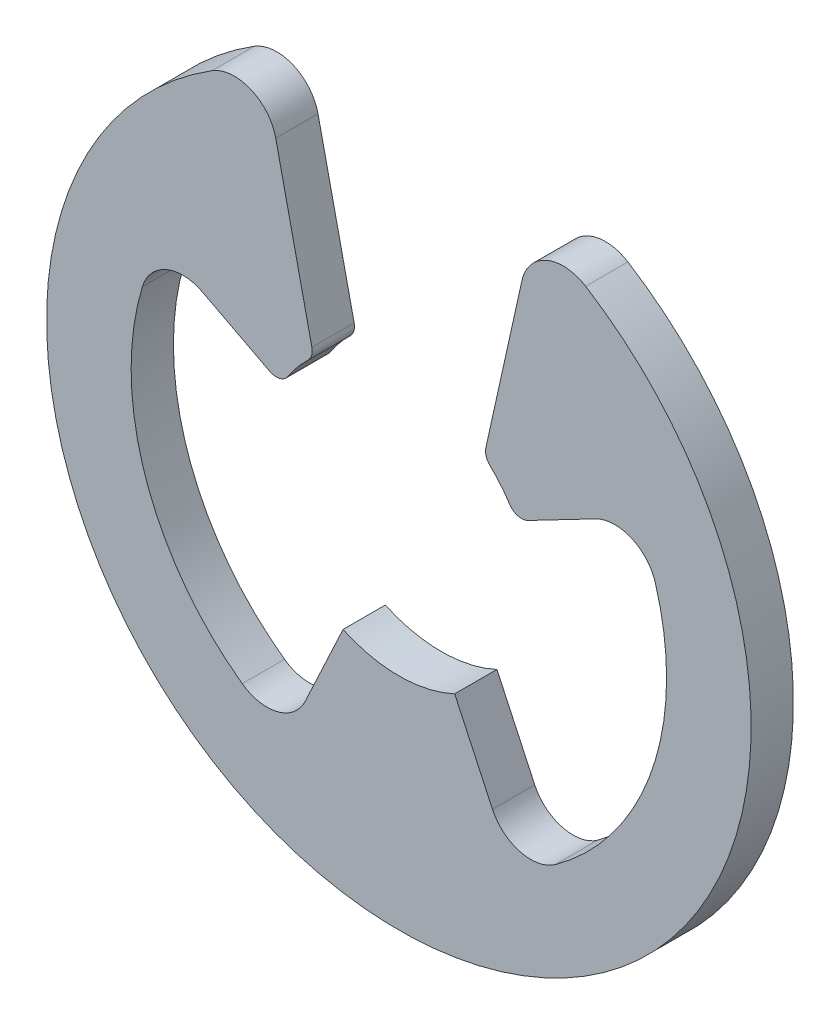
ISO-10303-21;
HEADER;
FILE_DESCRIPTION(('STEP AP214'),'2;1');
FILE_NAME('part.step','',(''),(''),'','','');
FILE_SCHEMA(('AUTOMOTIVE_DESIGN { 1 0 10303 214 1 1 1 1 }'));
ENDSEC;
DATA;
#1=APPLICATION_CONTEXT('core data for automotive mechanical design processes');
#2=APPLICATION_PROTOCOL_DEFINITION('international standard','automotive_design',2000,#1);
#3=PRODUCT_CONTEXT('',#1,'mechanical');
#4=PRODUCT('Part','Part','',(#3));
#5=PRODUCT_RELATED_PRODUCT_CATEGORY('part','',(#4));
#6=PRODUCT_DEFINITION_FORMATION('','',#4);
#7=PRODUCT_DEFINITION_CONTEXT('part definition',#1,'design');
#8=PRODUCT_DEFINITION('design','',#6,#7);
#9=PRODUCT_DEFINITION_SHAPE('','',#8);
#10=(LENGTH_UNIT() NAMED_UNIT(*) SI_UNIT(.MILLI.,.METRE.));
#11=(NAMED_UNIT(*) PLANE_ANGLE_UNIT() SI_UNIT($,.RADIAN.));
#12=(NAMED_UNIT(*) SI_UNIT($,.STERADIAN.) SOLID_ANGLE_UNIT());
#13=UNCERTAINTY_MEASURE_WITH_UNIT(LENGTH_MEASURE(1.E-05),#10,'distance_accuracy_value','');
#14=(GEOMETRIC_REPRESENTATION_CONTEXT(3) GLOBAL_UNCERTAINTY_ASSIGNED_CONTEXT((#13)) GLOBAL_UNIT_ASSIGNED_CONTEXT((#10,
#11,#12)) REPRESENTATION_CONTEXT('',''));
#15=CARTESIAN_POINT('',(0.,0.,0.));
#16=DIRECTION('',(0.,0.,1.));
#17=DIRECTION('',(1.,0.,0.));
#18=AXIS2_PLACEMENT_3D('',#15,#16,#17);
#19=CARTESIAN_POINT('',(0.,0.,0.1905));
#20=DIRECTION('',(0.,0.,1.));
#21=DIRECTION('',(1.,0.,0.));
#22=AXIS2_PLACEMENT_3D('',#19,#20,#21);
#23=PLANE('',#22);
#24=CARTESIAN_POINT('',(0.,0.,0.1905));
#25=DIRECTION('',(0.,0.,1.));
#26=DIRECTION('',(1.,0.,0.));
#27=AXIS2_PLACEMENT_3D('',#24,#25,#26);
#28=CIRCLE('',#27,1.190625);
#29=CARTESIAN_POINT('',(0.998772106594779,0.648106603664265,0.1905));
#30=VERTEX_POINT('',#29);
#31=CARTESIAN_POINT('',(0.820392617777429,0.862869540151522,0.1905));
#32=VERTEX_POINT('',#31);
#33=EDGE_CURVE('E234',#30,#32,#28,.T.);
#34=ORIENTED_EDGE('',*,*,#33,.F.);
#35=CARTESIAN_POINT('',(1.10530779796489,0.717237974721786,0.1905));
#36=DIRECTION('',(0.,0.,1.));
#37=DIRECTION('',(1.,0.,0.));
#38=AXIS2_PLACEMENT_3D('',#35,#36,#37);
#39=CIRCLE('',#38,0.127);
#40=CARTESIAN_POINT('',(1.16394987184574,0.604587598908153,0.1905));
#41=VERTEX_POINT('',#40);
#42=EDGE_CURVE('E271',#30,#41,#39,.T.);
#43=ORIENTED_EDGE('',*,*,#42,.T.);
#44=DIRECTION('',(-0.887010833178212,-0.461748613235053,0.));
#45=VECTOR('',#44,1.);
#46=CARTESIAN_POINT('',(0.000543242331921464,-0.00104355881023522,0.1905));
#47=LINE('',#46,#45);
#48=CARTESIAN_POINT('',(1.77078334990417,0.920485112757102,0.1905));
#49=VERTEX_POINT('',#48);
#50=EDGE_CURVE('E407',#49,#41,#47,.T.);
#51=ORIENTED_EDGE('',*,*,#50,.F.);
#52=CARTESIAN_POINT('',(1.94670957154672,0.582533985316203,0.1905));
#53=DIRECTION('',(0.,0.,1.));
#54=DIRECTION('',(1.,0.,0.));
#55=AXIS2_PLACEMENT_3D('',#52,#53,#54);
#56=CIRCLE('',#55,0.381);
#57=CARTESIAN_POINT('',(2.31171761621173,0.691759107562991,0.1905));
#58=VERTEX_POINT('',#57);
#59=EDGE_CURVE('E352',#49,#58,#56,.F.);
#60=ORIENTED_EDGE('',*,*,#59,.T.);
#61=CARTESIAN_POINT('',(0.,0.,0.1905));
#62=DIRECTION('',(0.,0.,1.));
#63=DIRECTION('',(1.,0.,0.));
#64=AXIS2_PLACEMENT_3D('',#61,#62,#63);
#65=CIRCLE('',#64,2.413);
#66=CARTESIAN_POINT('',(1.4114582097649,-1.95712920423953,0.1905));
#67=VERTEX_POINT('',#66);
#68=EDGE_CURVE('E418',#67,#58,#65,.T.);
#69=ORIENTED_EDGE('',*,*,#68,.F.);
#70=CARTESIAN_POINT('',(1.18859638717044,-1.64810880357013,0.1905));
#71=DIRECTION('',(0.,0.,1.));
#72=DIRECTION('',(1.,0.,0.));
#73=AXIS2_PLACEMENT_3D('',#70,#71,#72);
#74=CIRCLE('',#73,0.381);
#75=CARTESIAN_POINT('',(0.843293120309478,-1.80912636129334,0.1905));
#76=VERTEX_POINT('',#75);
#77=EDGE_CURVE('E358',#67,#76,#74,.F.);
#78=ORIENTED_EDGE('',*,*,#77,.T.);
#79=DIRECTION('',(0.4226182617407,-0.90630778703665,0.));
#80=VECTOR('',#79,1.);
#81=CARTESIAN_POINT('',(-0.000259853295255621,-0.000121171581574508,0.1905));
#82=LINE('',#81,#80);
#83=CARTESIAN_POINT('',(0.50292,-1.07919384923423,0.1905));
#84=VERTEX_POINT('',#83);
#85=EDGE_CURVE('E414',#84,#76,#82,.T.);
#86=ORIENTED_EDGE('',*,*,#85,.F.);
#87=CARTESIAN_POINT('',(-0.50292,-1.07919384923423,0.1905));
#88=VERTEX_POINT('',#87);
#89=EDGE_CURVE('E468',#88,#84,#28,.T.);
#90=ORIENTED_EDGE('',*,*,#89,.F.);
#91=DIRECTION('',(-0.4226182617407,-0.90630778703665,0.));
#92=VECTOR('',#91,1.);
#93=CARTESIAN_POINT('',(0.000259853295255621,-0.000121171581574508,0.1905));
#94=LINE('',#93,#92);
#95=CARTESIAN_POINT('',(-0.843293120309478,-1.80912636129334,0.1905));
#96=VERTEX_POINT('',#95);
#97=EDGE_CURVE('E206',#88,#96,#94,.T.);
#98=ORIENTED_EDGE('',*,*,#97,.T.);
#99=CARTESIAN_POINT('',(-1.18859638717044,-1.64810880357013,0.1905));
#100=DIRECTION('',(0.,0.,1.));
#101=DIRECTION('',(1.,0.,0.));
#102=AXIS2_PLACEMENT_3D('',#99,#100,#101);
#103=CIRCLE('',#102,0.381);
#104=CARTESIAN_POINT('',(-1.4114582097649,-1.95712920423953,0.1905));
#105=VERTEX_POINT('',#104);
#106=EDGE_CURVE('E364',#96,#105,#103,.F.);
#107=ORIENTED_EDGE('',*,*,#106,.T.);
#108=CARTESIAN_POINT('',(0.,0.,0.1905));
#109=DIRECTION('',(0.,0.,1.));
#110=DIRECTION('',(1.,0.,0.));
#111=AXIS2_PLACEMENT_3D('',#108,#109,#110);
#112=CIRCLE('',#111,2.413);
#113=CARTESIAN_POINT('',(-2.31171761621173,0.691759107562991,0.1905));
#114=VERTEX_POINT('',#113);
#115=EDGE_CURVE('E376',#114,#105,#112,.T.);
#116=ORIENTED_EDGE('',*,*,#115,.F.);
#117=CARTESIAN_POINT('',(-1.94670957154672,0.582533985316203,0.1905));
#118=DIRECTION('',(0.,0.,1.));
#119=DIRECTION('',(1.,0.,0.));
#120=AXIS2_PLACEMENT_3D('',#117,#118,#119);
#121=CIRCLE('',#120,0.381);
#122=CARTESIAN_POINT('',(-1.77078334990417,0.920485112757102,0.1905));
#123=VERTEX_POINT('',#122);
#124=EDGE_CURVE('E58',#114,#123,#121,.F.);
#125=ORIENTED_EDGE('',*,*,#124,.T.);
#126=DIRECTION('',(0.887010833178212,-0.461748613235053,0.));
#127=VECTOR('',#126,1.);
#128=CARTESIAN_POINT('',(-0.000543242331921464,-0.00104355881023522,0.1905));
#129=LINE('',#128,#127);
#130=CARTESIAN_POINT('',(-1.16394987184574,0.604587598908153,0.1905));
#131=VERTEX_POINT('',#130);
#132=EDGE_CURVE('E374',#123,#131,#129,.T.);
#133=ORIENTED_EDGE('',*,*,#132,.T.);
#134=CARTESIAN_POINT('',(-1.10530779796489,0.717237974721786,0.1905));
#135=DIRECTION('',(0.,0.,1.));
#136=DIRECTION('',(1.,0.,0.));
#137=AXIS2_PLACEMENT_3D('',#134,#135,#136);
#138=CIRCLE('',#137,0.127);
#139=CARTESIAN_POINT('',(-0.998772106594779,0.648106603664265,0.1905));
#140=VERTEX_POINT('',#139);
#141=EDGE_CURVE('E265',#131,#140,#138,.T.);
#142=ORIENTED_EDGE('',*,*,#141,.T.);
#143=CARTESIAN_POINT('',(-0.820392617777429,0.862869540151522,0.1905));
#144=VERTEX_POINT('',#143);
#145=EDGE_CURVE('E239',#144,#140,#28,.T.);
#146=ORIENTED_EDGE('',*,*,#145,.F.);
#147=CARTESIAN_POINT('',(-0.907901163673688,0.954908957767684,0.1905));
#148=DIRECTION('',(0.,0.,1.));
#149=DIRECTION('',(1.,0.,0.));
#150=AXIS2_PLACEMENT_3D('',#147,#148,#149);
#151=CIRCLE('',#150,0.127);
#152=CARTESIAN_POINT('',(-0.783911570769456,0.982396788737821,0.1905));
#153=VERTEX_POINT('',#152);
#154=EDGE_CURVE('E262',#144,#153,#151,.T.);
#155=ORIENTED_EDGE('',*,*,#154,.T.);
#156=DIRECTION('',(0.216439613938088,-0.976296007119937,0.));
#157=VECTOR('',#156,1.);
#158=CARTESIAN_POINT('',(-1.27,3.17499999999993,0.1905));
#159=LINE('',#158,#157);
#160=CARTESIAN_POINT('',(-1.1095646416725,2.45132286490397,0.1905));
#161=VERTEX_POINT('',#160);
#162=EDGE_CURVE('E212',#161,#153,#159,.T.);
#163=ORIENTED_EDGE('',*,*,#162,.F.);
#164=CARTESIAN_POINT('',(-1.4815334203852,2.36885937199356,0.1905));
#165=DIRECTION('',(0.,0.,1.));
#166=DIRECTION('',(1.,0.,0.));
#167=AXIS2_PLACEMENT_3D('',#164,#165,#166);
#168=CIRCLE('',#167,0.381);
#169=CARTESIAN_POINT('',(-1.68356070498318,2.69188564999268,0.1905));
#170=VERTEX_POINT('',#169);
#171=EDGE_CURVE('E256',#161,#170,#168,.T.);
#172=ORIENTED_EDGE('',*,*,#171,.T.);
#173=CARTESIAN_POINT('',(0.,0.,0.1905));
#174=DIRECTION('',(0.,0.,1.));
#175=DIRECTION('',(1.,0.,0.));
#176=AXIS2_PLACEMENT_3D('',#173,#174,#175);
#177=CIRCLE('',#176,3.175);
#178=CARTESIAN_POINT('',(1.68356070498318,2.69188564999268,0.1905));
#179=VERTEX_POINT('',#178);
#180=EDGE_CURVE('E241',#170,#179,#177,.T.);
#181=ORIENTED_EDGE('',*,*,#180,.T.);
#182=CARTESIAN_POINT('',(1.4815334203852,2.36885937199356,0.1905));
#183=DIRECTION('',(0.,0.,1.));
#184=DIRECTION('',(1.,0.,0.));
#185=AXIS2_PLACEMENT_3D('',#182,#183,#184);
#186=CIRCLE('',#185,0.381);
#187=CARTESIAN_POINT('',(1.1095646416725,2.45132286490397,0.1905));
#188=VERTEX_POINT('',#187);
#189=EDGE_CURVE('E259',#179,#188,#186,.T.);
#190=ORIENTED_EDGE('',*,*,#189,.T.);
#191=DIRECTION('',(0.216439613938088,0.976296007119937,0.));
#192=VECTOR('',#191,1.);
#193=CARTESIAN_POINT('',(0.635,0.31070010017431,0.1905));
#194=LINE('',#193,#192);
#195=CARTESIAN_POINT('',(0.783911570769456,0.982396788737821,0.1905));
#196=VERTEX_POINT('',#195);
#197=EDGE_CURVE('E430',#196,#188,#194,.T.);
#198=ORIENTED_EDGE('',*,*,#197,.F.);
#199=CARTESIAN_POINT('',(0.907901163673688,0.954908957767684,0.1905));
#200=DIRECTION('',(0.,0.,1.));
#201=DIRECTION('',(1.,0.,0.));
#202=AXIS2_PLACEMENT_3D('',#199,#200,#201);
#203=CIRCLE('',#202,0.127);
#204=EDGE_CURVE('E268',#196,#32,#203,.T.);
#205=ORIENTED_EDGE('',*,*,#204,.T.);
#206=EDGE_LOOP('',(#34,#43,#51,#60,#69,#78,#86,#90,#98,#107,#116,#125,#133,#142,#146,#155,#163,
#172,#181,#190,#198,#205));
#207=FACE_BOUND('',#206,.T.);
#208=ADVANCED_FACE('F49',(#207),#23,.T.);
#209=CARTESIAN_POINT('',(0.,0.,-0.1905));
#210=DIRECTION('',(0.,0.,1.));
#211=DIRECTION('',(1.,0.,0.));
#212=AXIS2_PLACEMENT_3D('',#209,#210,#211);
#213=PLANE('',#212);
#214=DIRECTION('',(-0.887010833178212,-0.461748613235053,0.));
#215=VECTOR('',#214,1.);
#216=CARTESIAN_POINT('',(0.000543242331921464,-0.00104355881023522,-0.1905));
#217=LINE('',#216,#215);
#218=CARTESIAN_POINT('',(1.77078334990417,0.920485112757102,-0.1905));
#219=VERTEX_POINT('',#218);
#220=CARTESIAN_POINT('',(1.16394987184574,0.604587598908153,-0.1905));
#221=VERTEX_POINT('',#220);
#222=EDGE_CURVE('E411',#219,#221,#217,.T.);
#223=ORIENTED_EDGE('',*,*,#222,.T.);
#224=CARTESIAN_POINT('',(1.10530779796489,0.717237974721786,-0.1905));
#225=DIRECTION('',(0.,0.,1.));
#226=DIRECTION('',(1.,0.,0.));
#227=AXIS2_PLACEMENT_3D('',#224,#225,#226);
#228=CIRCLE('',#227,0.127);
#229=CARTESIAN_POINT('',(0.998772106594779,0.648106603664265,-0.1905));
#230=VERTEX_POINT('',#229);
#231=EDGE_CURVE('E295',#221,#230,#228,.F.);
#232=ORIENTED_EDGE('',*,*,#231,.T.);
#233=CARTESIAN_POINT('',(0.,0.,-0.1905));
#234=DIRECTION('',(0.,0.,1.));
#235=DIRECTION('',(1.,0.,0.));
#236=AXIS2_PLACEMENT_3D('',#233,#234,#235);
#237=CIRCLE('',#236,1.190625);
#238=CARTESIAN_POINT('',(0.820392617777429,0.862869540151522,-0.1905));
#239=VERTEX_POINT('',#238);
#240=EDGE_CURVE('E230',#230,#239,#237,.T.);
#241=ORIENTED_EDGE('',*,*,#240,.T.);
#242=CARTESIAN_POINT('',(0.907901163673688,0.954908957767684,-0.1905));
#243=DIRECTION('',(0.,0.,1.));
#244=DIRECTION('',(1.,0.,0.));
#245=AXIS2_PLACEMENT_3D('',#242,#243,#244);
#246=CIRCLE('',#245,0.127);
#247=CARTESIAN_POINT('',(0.783911570769456,0.982396788737821,-0.1905));
#248=VERTEX_POINT('',#247);
#249=EDGE_CURVE('E292',#239,#248,#246,.F.);
#250=ORIENTED_EDGE('',*,*,#249,.T.);
#251=DIRECTION('',(0.216439613938088,0.976296007119937,0.));
#252=VECTOR('',#251,1.);
#253=CARTESIAN_POINT('',(0.635,0.31070010017431,-0.1905));
#254=LINE('',#253,#252);
#255=CARTESIAN_POINT('',(1.1095646416725,2.45132286490397,-0.1905));
#256=VERTEX_POINT('',#255);
#257=EDGE_CURVE('E236',#248,#256,#254,.T.);
#258=ORIENTED_EDGE('',*,*,#257,.T.);
#259=CARTESIAN_POINT('',(1.4815334203852,2.36885937199356,-0.1905));
#260=DIRECTION('',(0.,0.,1.));
#261=DIRECTION('',(1.,0.,0.));
#262=AXIS2_PLACEMENT_3D('',#259,#260,#261);
#263=CIRCLE('',#262,0.381);
#264=CARTESIAN_POINT('',(1.68356070498318,2.69188564999268,-0.1905));
#265=VERTEX_POINT('',#264);
#266=EDGE_CURVE('E284',#256,#265,#263,.F.);
#267=ORIENTED_EDGE('',*,*,#266,.T.);
#268=CARTESIAN_POINT('',(0.,0.,-0.1905));
#269=DIRECTION('',(0.,0.,1.));
#270=DIRECTION('',(1.,0.,0.));
#271=AXIS2_PLACEMENT_3D('',#268,#269,#270);
#272=CIRCLE('',#271,3.175);
#273=CARTESIAN_POINT('',(-1.68356070498318,2.69188564999268,-0.1905));
#274=VERTEX_POINT('',#273);
#275=EDGE_CURVE('E246',#274,#265,#272,.T.);
#276=ORIENTED_EDGE('',*,*,#275,.F.);
#277=CARTESIAN_POINT('',(-1.4815334203852,2.36885937199356,-0.1905));
#278=DIRECTION('',(0.,0.,1.));
#279=DIRECTION('',(1.,0.,0.));
#280=AXIS2_PLACEMENT_3D('',#277,#278,#279);
#281=CIRCLE('',#280,0.381);
#282=CARTESIAN_POINT('',(-1.1095646416725,2.45132286490397,-0.1905));
#283=VERTEX_POINT('',#282);
#284=EDGE_CURVE('E281',#274,#283,#281,.F.);
#285=ORIENTED_EDGE('',*,*,#284,.T.);
#286=DIRECTION('',(0.216439613938088,-0.976296007119937,0.));
#287=VECTOR('',#286,1.);
#288=CARTESIAN_POINT('',(-1.27,3.17499999999993,-0.1905));
#289=LINE('',#288,#287);
#290=CARTESIAN_POINT('',(-0.783911570769456,0.982396788737821,-0.1905));
#291=VERTEX_POINT('',#290);
#292=EDGE_CURVE('E427',#283,#291,#289,.T.);
#293=ORIENTED_EDGE('',*,*,#292,.T.);
#294=CARTESIAN_POINT('',(-0.907901163673688,0.954908957767684,-0.1905));
#295=DIRECTION('',(0.,0.,1.));
#296=DIRECTION('',(1.,0.,0.));
#297=AXIS2_PLACEMENT_3D('',#294,#295,#296);
#298=CIRCLE('',#297,0.127);
#299=CARTESIAN_POINT('',(-0.820392617777429,0.862869540151522,-0.1905));
#300=VERTEX_POINT('',#299);
#301=EDGE_CURVE('E72',#291,#300,#298,.F.);
#302=ORIENTED_EDGE('',*,*,#301,.T.);
#303=CARTESIAN_POINT('',(-0.998772106594779,0.648106603664265,-0.1905));
#304=VERTEX_POINT('',#303);
#305=EDGE_CURVE('E229',#300,#304,#237,.T.);
#306=ORIENTED_EDGE('',*,*,#305,.T.);
#307=CARTESIAN_POINT('',(-1.10530779796489,0.717237974721786,-0.1905));
#308=DIRECTION('',(0.,0.,1.));
#309=DIRECTION('',(1.,0.,0.));
#310=AXIS2_PLACEMENT_3D('',#307,#308,#309);
#311=CIRCLE('',#310,0.127);
#312=CARTESIAN_POINT('',(-1.16394987184574,0.604587598908153,-0.1905));
#313=VERTEX_POINT('',#312);
#314=EDGE_CURVE('E289',#304,#313,#311,.F.);
#315=ORIENTED_EDGE('',*,*,#314,.T.);
#316=DIRECTION('',(0.887010833178212,-0.461748613235053,0.));
#317=VECTOR('',#316,1.);
#318=CARTESIAN_POINT('',(-0.000543242331921464,-0.00104355881023522,-0.1905));
#319=LINE('',#318,#317);
#320=CARTESIAN_POINT('',(-1.77078334990417,0.920485112757102,-0.1905));
#321=VERTEX_POINT('',#320);
#322=EDGE_CURVE('E390',#321,#313,#319,.T.);
#323=ORIENTED_EDGE('',*,*,#322,.F.);
#324=CARTESIAN_POINT('',(-1.94670957154672,0.582533985316203,-0.1905));
#325=DIRECTION('',(0.,0.,1.));
#326=DIRECTION('',(1.,0.,0.));
#327=AXIS2_PLACEMENT_3D('',#324,#325,#326);
#328=CIRCLE('',#327,0.381);
#329=CARTESIAN_POINT('',(-2.31171761621173,0.691759107562991,-0.1905));
#330=VERTEX_POINT('',#329);
#331=EDGE_CURVE('E12',#321,#330,#328,.T.);
#332=ORIENTED_EDGE('',*,*,#331,.T.);
#333=CARTESIAN_POINT('',(0.,0.,-0.1905));
#334=DIRECTION('',(0.,0.,1.));
#335=DIRECTION('',(1.,0.,0.));
#336=AXIS2_PLACEMENT_3D('',#333,#334,#335);
#337=CIRCLE('',#336,2.413);
#338=CARTESIAN_POINT('',(-1.4114582097649,-1.95712920423953,-0.1905));
#339=VERTEX_POINT('',#338);
#340=EDGE_CURVE('E223',#330,#339,#337,.T.);
#341=ORIENTED_EDGE('',*,*,#340,.T.);
#342=CARTESIAN_POINT('',(-1.18859638717044,-1.64810880357013,-0.1905));
#343=DIRECTION('',(0.,0.,1.));
#344=DIRECTION('',(1.,0.,0.));
#345=AXIS2_PLACEMENT_3D('',#342,#343,#344);
#346=CIRCLE('',#345,0.381);
#347=CARTESIAN_POINT('',(-0.843293120309478,-1.80912636129334,-0.1905));
#348=VERTEX_POINT('',#347);
#349=EDGE_CURVE('E221',#339,#348,#346,.T.);
#350=ORIENTED_EDGE('',*,*,#349,.T.);
#351=DIRECTION('',(-0.4226182617407,-0.90630778703665,0.));
#352=VECTOR('',#351,1.);
#353=CARTESIAN_POINT('',(0.000259853295255621,-0.000121171581574508,-0.1905));
#354=LINE('',#353,#352);
#355=CARTESIAN_POINT('',(-0.50292,-1.07919384923423,-0.1905));
#356=VERTEX_POINT('',#355);
#357=EDGE_CURVE('E203',#356,#348,#354,.T.);
#358=ORIENTED_EDGE('',*,*,#357,.F.);
#359=CARTESIAN_POINT('',(0.50292,-1.07919384923423,-0.1905));
#360=VERTEX_POINT('',#359);
#361=EDGE_CURVE('E218',#356,#360,#237,.T.);
#362=ORIENTED_EDGE('',*,*,#361,.T.);
#363=DIRECTION('',(0.4226182617407,-0.90630778703665,0.));
#364=VECTOR('',#363,1.);
#365=CARTESIAN_POINT('',(-0.000259853295255621,-0.000121171581574508,-0.1905));
#366=LINE('',#365,#364);
#367=CARTESIAN_POINT('',(0.843293120309478,-1.80912636129334,-0.1905));
#368=VERTEX_POINT('',#367);
#369=EDGE_CURVE('E403',#360,#368,#366,.T.);
#370=ORIENTED_EDGE('',*,*,#369,.T.);
#371=CARTESIAN_POINT('',(1.18859638717044,-1.64810880357013,-0.1905));
#372=DIRECTION('',(0.,0.,1.));
#373=DIRECTION('',(1.,0.,0.));
#374=AXIS2_PLACEMENT_3D('',#371,#372,#373);
#375=CIRCLE('',#374,0.381);
#376=CARTESIAN_POINT('',(1.4114582097649,-1.95712920423953,-0.1905));
#377=VERTEX_POINT('',#376);
#378=EDGE_CURVE('E361',#368,#377,#375,.T.);
#379=ORIENTED_EDGE('',*,*,#378,.T.);
#380=CARTESIAN_POINT('',(0.,0.,-0.1905));
#381=DIRECTION('',(0.,0.,1.));
#382=DIRECTION('',(1.,0.,0.));
#383=AXIS2_PLACEMENT_3D('',#380,#381,#382);
#384=CIRCLE('',#383,2.413);
#385=CARTESIAN_POINT('',(2.31171761621173,0.691759107562991,-0.1905));
#386=VERTEX_POINT('',#385);
#387=EDGE_CURVE('E406',#377,#386,#384,.T.);
#388=ORIENTED_EDGE('',*,*,#387,.T.);
#389=CARTESIAN_POINT('',(1.94670957154672,0.582533985316203,-0.1905));
#390=DIRECTION('',(0.,0.,1.));
#391=DIRECTION('',(1.,0.,0.));
#392=AXIS2_PLACEMENT_3D('',#389,#390,#391);
#393=CIRCLE('',#392,0.381);
#394=EDGE_CURVE('E355',#386,#219,#393,.T.);
#395=ORIENTED_EDGE('',*,*,#394,.T.);
#396=EDGE_LOOP('',(#223,#232,#241,#250,#258,#267,#276,#285,#293,#302,#306,#315,#323,#332,#341,
#350,#358,#362,#370,#379,#388,#395));
#397=FACE_BOUND('',#396,.T.);
#398=ADVANCED_FACE('F216',(#397),#213,.F.);
#399=CARTESIAN_POINT('',(0.,0.,0.1905));
#400=DIRECTION('',(0.,0.,-1.));
#401=DIRECTION('',(-1.,0.,0.));
#402=AXIS2_PLACEMENT_3D('',#399,#400,#401);
#403=CYLINDRICAL_SURFACE('',#402,1.190625);
#404=ORIENTED_EDGE('',*,*,#145,.T.);
#405=DIRECTION('',(0.,0.,-1.));
#406=VECTOR('',#405,1.);
#407=CARTESIAN_POINT('',(-0.998772106594779,0.648106603664265,0.1905));
#408=LINE('',#407,#406);
#409=EDGE_CURVE('E65',#140,#304,#408,.T.);
#410=ORIENTED_EDGE('',*,*,#409,.T.);
#411=ORIENTED_EDGE('',*,*,#305,.F.);
#412=DIRECTION('',(0.,0.,-1.));
#413=VECTOR('',#412,1.);
#414=CARTESIAN_POINT('',(-0.820392617777429,0.862869540151522,0.1905));
#415=LINE('',#414,#413);
#416=EDGE_CURVE('E312',#300,#144,#415,.F.);
#417=ORIENTED_EDGE('',*,*,#416,.T.);
#418=EDGE_LOOP('',(#404,#410,#411,#417));
#419=FACE_BOUND('',#418,.T.);
#420=ADVANCED_FACE('F466',(#419),#403,.F.);
#421=ORIENTED_EDGE('',*,*,#361,.F.);
#422=DIRECTION('',(0.,0.,1.));
#423=VECTOR('',#422,1.);
#424=CARTESIAN_POINT('',(-0.50292,-1.07919384923423,-0.1905));
#425=LINE('',#424,#423);
#426=EDGE_CURVE('E199',#356,#88,#425,.T.);
#427=ORIENTED_EDGE('',*,*,#426,.T.);
#428=ORIENTED_EDGE('',*,*,#89,.T.);
#429=DIRECTION('',(0.,0.,1.));
#430=VECTOR('',#429,1.);
#431=CARTESIAN_POINT('',(0.50292,-1.07919384923423,-0.1905));
#432=LINE('',#431,#430);
#433=EDGE_CURVE('E227',#360,#84,#432,.T.);
#434=ORIENTED_EDGE('',*,*,#433,.F.);
#435=EDGE_LOOP('',(#421,#427,#428,#434));
#436=FACE_BOUND('',#435,.T.);
#437=ADVANCED_FACE('F226',(#436),#403,.F.);
#438=CARTESIAN_POINT('',(0.,0.,0.1905));
#439=DIRECTION('',(0.,0.,-1.));
#440=DIRECTION('',(-1.,0.,0.));
#441=AXIS2_PLACEMENT_3D('',#438,#439,#440);
#442=CYLINDRICAL_SURFACE('',#441,3.175);
#443=ORIENTED_EDGE('',*,*,#275,.T.);
#444=DIRECTION('',(0.,0.,-1.));
#445=VECTOR('',#444,1.);
#446=CARTESIAN_POINT('',(1.68356070498318,2.69188564999268,0.1905));
#447=LINE('',#446,#445);
#448=EDGE_CURVE('E328',#265,#179,#447,.F.);
#449=ORIENTED_EDGE('',*,*,#448,.T.);
#450=ORIENTED_EDGE('',*,*,#180,.F.);
#451=DIRECTION('',(0.,0.,-1.));
#452=VECTOR('',#451,1.);
#453=CARTESIAN_POINT('',(-1.68356070498318,2.69188564999268,0.1905));
#454=LINE('',#453,#452);
#455=EDGE_CURVE('E324',#170,#274,#454,.T.);
#456=ORIENTED_EDGE('',*,*,#455,.T.);
#457=EDGE_LOOP('',(#443,#449,#450,#456));
#458=FACE_BOUND('',#457,.T.);
#459=ADVANCED_FACE('F450',(#458),#442,.T.);
#460=ORIENTED_EDGE('',*,*,#240,.F.);
#461=DIRECTION('',(0.,0.,-1.));
#462=VECTOR('',#461,1.);
#463=CARTESIAN_POINT('',(0.998772106594779,0.648106603664265,0.1905));
#464=LINE('',#463,#462);
#465=EDGE_CURVE('E252',#230,#30,#464,.F.);
#466=ORIENTED_EDGE('',*,*,#465,.T.);
#467=ORIENTED_EDGE('',*,*,#33,.T.);
#468=DIRECTION('',(0.,0.,-1.));
#469=VECTOR('',#468,1.);
#470=CARTESIAN_POINT('',(0.820392617777429,0.862869540151522,0.1905));
#471=LINE('',#470,#469);
#472=EDGE_CURVE('E245',#32,#239,#471,.T.);
#473=ORIENTED_EDGE('',*,*,#472,.T.);
#474=EDGE_LOOP('',(#460,#466,#467,#473));
#475=FACE_BOUND('',#474,.T.);
#476=ADVANCED_FACE('F475',(#475),#403,.F.);
#477=CARTESIAN_POINT('',(0.635,0.31070010017431,-0.1905));
#478=DIRECTION('',(0.976296007119937,-0.216439613938088,0.));
#479=DIRECTION('',(0.216439613938088,0.976296007119937,0.));
#480=AXIS2_PLACEMENT_3D('',#477,#478,#479);
#481=PLANE('',#480);
#482=ORIENTED_EDGE('',*,*,#257,.F.);
#483=DIRECTION('',(0.,0.,1.));
#484=VECTOR('',#483,1.);
#485=CARTESIAN_POINT('',(0.783911570769456,0.982396788737821,0.1905));
#486=LINE('',#485,#484);
#487=EDGE_CURVE('E301',#248,#196,#486,.T.);
#488=ORIENTED_EDGE('',*,*,#487,.T.);
#489=ORIENTED_EDGE('',*,*,#197,.T.);
#490=DIRECTION('',(0.,0.,-1.));
#491=VECTOR('',#490,1.);
#492=CARTESIAN_POINT('',(1.1095646416725,2.45132286490397,-0.1905));
#493=LINE('',#492,#491);
#494=EDGE_CURVE('E298',#188,#256,#493,.T.);
#495=ORIENTED_EDGE('',*,*,#494,.T.);
#496=EDGE_LOOP('',(#482,#488,#489,#495));
#497=FACE_BOUND('',#496,.T.);
#498=ADVANCED_FACE('F442',(#497),#481,.F.);
#499=CARTESIAN_POINT('',(-1.27,3.17499999999993,-0.1905));
#500=DIRECTION('',(-0.976296007119937,-0.216439613938088,0.));
#501=DIRECTION('',(0.216439613938088,-0.976296007119937,0.));
#502=AXIS2_PLACEMENT_3D('',#499,#500,#501);
#503=PLANE('',#502);
#504=ORIENTED_EDGE('',*,*,#162,.T.);
#505=DIRECTION('',(0.,0.,1.));
#506=VECTOR('',#505,1.);
#507=CARTESIAN_POINT('',(-0.783911570769457,0.982396788737821,-0.1905));
#508=LINE('',#507,#506);
#509=EDGE_CURVE('E320',#153,#291,#508,.F.);
#510=ORIENTED_EDGE('',*,*,#509,.T.);
#511=ORIENTED_EDGE('',*,*,#292,.F.);
#512=DIRECTION('',(0.,0.,-1.));
#513=VECTOR('',#512,1.);
#514=CARTESIAN_POINT('',(-1.1095646416725,2.45132286490397,-0.1905));
#515=LINE('',#514,#513);
#516=EDGE_CURVE('E317',#283,#161,#515,.F.);
#517=ORIENTED_EDGE('',*,*,#516,.T.);
#518=EDGE_LOOP('',(#504,#510,#511,#517));
#519=FACE_BOUND('',#518,.T.);
#520=ADVANCED_FACE('F458',(#519),#503,.F.);
#521=CARTESIAN_POINT('',(-0.000259853295255621,-0.000121171581574508,-0.1905));
#522=DIRECTION('',(-0.90630778703665,-0.4226182617407,0.));
#523=DIRECTION('',(0.4226182617407,-0.90630778703665,0.));
#524=AXIS2_PLACEMENT_3D('',#521,#522,#523);
#525=PLANE('',#524);
#526=ORIENTED_EDGE('',*,*,#85,.T.);
#527=DIRECTION('',(0.,0.,-1.));
#528=VECTOR('',#527,1.);
#529=CARTESIAN_POINT('',(0.843293120309478,-1.80912636129334,-0.1905));
#530=LINE('',#529,#528);
#531=EDGE_CURVE('E339',#76,#368,#530,.T.);
#532=ORIENTED_EDGE('',*,*,#531,.T.);
#533=ORIENTED_EDGE('',*,*,#369,.F.);
#534=ORIENTED_EDGE('',*,*,#433,.T.);
#535=EDGE_LOOP('',(#526,#532,#533,#534));
#536=FACE_BOUND('',#535,.T.);
#537=ADVANCED_FACE('F504',(#536),#525,.F.);
#538=CARTESIAN_POINT('',(0.000543242331921464,-0.00104355881023522,-0.1905));
#539=DIRECTION('',(-0.461748613235053,0.887010833178212,0.));
#540=DIRECTION('',(-0.887010833178212,-0.461748613235053,0.));
#541=AXIS2_PLACEMENT_3D('',#538,#539,#540);
#542=PLANE('',#541);
#543=ORIENTED_EDGE('',*,*,#50,.T.);
#544=DIRECTION('',(0.,0.,1.));
#545=VECTOR('',#544,1.);
#546=CARTESIAN_POINT('',(1.16394987184574,0.604587598908153,-0.1905));
#547=LINE('',#546,#545);
#548=EDGE_CURVE('E278',#41,#221,#547,.F.);
#549=ORIENTED_EDGE('',*,*,#548,.T.);
#550=ORIENTED_EDGE('',*,*,#222,.F.);
#551=DIRECTION('',(0.,0.,-1.));
#552=VECTOR('',#551,1.);
#553=CARTESIAN_POINT('',(1.77078334990417,0.920485112757102,0.1905));
#554=LINE('',#553,#552);
#555=EDGE_CURVE('E274',#219,#49,#554,.F.);
#556=ORIENTED_EDGE('',*,*,#555,.T.);
#557=EDGE_LOOP('',(#543,#549,#550,#556));
#558=FACE_BOUND('',#557,.T.);
#559=ADVANCED_FACE('F486',(#558),#542,.F.);
#560=CARTESIAN_POINT('',(0.,0.,-0.1905));
#561=DIRECTION('',(0.,0.,1.));
#562=DIRECTION('',(1.,0.,0.));
#563=AXIS2_PLACEMENT_3D('',#560,#561,#562);
#564=CYLINDRICAL_SURFACE('',#563,2.413);
#565=ORIENTED_EDGE('',*,*,#68,.T.);
#566=DIRECTION('',(0.,0.,1.));
#567=VECTOR('',#566,1.);
#568=CARTESIAN_POINT('',(2.31171761621173,0.691759107562991,-0.1905));
#569=LINE('',#568,#567);
#570=EDGE_CURVE('E336',#58,#386,#569,.F.);
#571=ORIENTED_EDGE('',*,*,#570,.T.);
#572=ORIENTED_EDGE('',*,*,#387,.F.);
#573=DIRECTION('',(0.,0.,1.));
#574=VECTOR('',#573,1.);
#575=CARTESIAN_POINT('',(1.4114582097649,-1.95712920423953,-0.1905));
#576=LINE('',#575,#574);
#577=EDGE_CURVE('E332',#377,#67,#576,.T.);
#578=ORIENTED_EDGE('',*,*,#577,.T.);
#579=EDGE_LOOP('',(#565,#571,#572,#578));
#580=FACE_BOUND('',#579,.T.);
#581=ADVANCED_FACE('F495',(#580),#564,.F.);
#582=CARTESIAN_POINT('',(-0.000543242331921464,-0.00104355881023522,-0.1905));
#583=DIRECTION('',(-0.461748613235053,-0.887010833178212,0.));
#584=DIRECTION('',(0.887010833178212,-0.461748613235053,0.));
#585=AXIS2_PLACEMENT_3D('',#582,#583,#584);
#586=PLANE('',#585);
#587=ORIENTED_EDGE('',*,*,#322,.T.);
#588=DIRECTION('',(0.,0.,-1.));
#589=VECTOR('',#588,1.);
#590=CARTESIAN_POINT('',(-1.16394987184574,0.604587598908153,-0.1905));
#591=LINE('',#590,#589);
#592=EDGE_CURVE('E308',#313,#131,#591,.F.);
#593=ORIENTED_EDGE('',*,*,#592,.T.);
#594=ORIENTED_EDGE('',*,*,#132,.F.);
#595=DIRECTION('',(0.,0.,1.));
#596=VECTOR('',#595,1.);
#597=CARTESIAN_POINT('',(-1.77078334990417,0.920485112757102,-0.1905));
#598=LINE('',#597,#596);
#599=EDGE_CURVE('E305',#123,#321,#598,.F.);
#600=ORIENTED_EDGE('',*,*,#599,.T.);
#601=EDGE_LOOP('',(#587,#593,#594,#600));
#602=FACE_BOUND('',#601,.T.);
#603=ADVANCED_FACE('F382',(#602),#586,.T.);
#604=CARTESIAN_POINT('',(0.000259853295255621,-0.000121171581574508,-0.1905));
#605=DIRECTION('',(-0.90630778703665,0.4226182617407,0.));
#606=DIRECTION('',(-0.4226182617407,-0.90630778703665,0.));
#607=AXIS2_PLACEMENT_3D('',#604,#605,#606);
#608=PLANE('',#607);
#609=ORIENTED_EDGE('',*,*,#357,.T.);
#610=DIRECTION('',(0.,0.,1.));
#611=VECTOR('',#610,1.);
#612=CARTESIAN_POINT('',(-0.843293120309478,-1.80912636129334,-0.1905));
#613=LINE('',#612,#611);
#614=EDGE_CURVE('E342',#348,#96,#613,.T.);
#615=ORIENTED_EDGE('',*,*,#614,.T.);
#616=ORIENTED_EDGE('',*,*,#97,.F.);
#617=ORIENTED_EDGE('',*,*,#426,.F.);
#618=EDGE_LOOP('',(#609,#615,#616,#617));
#619=FACE_BOUND('',#618,.T.);
#620=ADVANCED_FACE('F201',(#619),#608,.T.);
#621=CARTESIAN_POINT('',(0.,0.,-0.1905));
#622=DIRECTION('',(0.,0.,1.));
#623=DIRECTION('',(1.,0.,0.));
#624=AXIS2_PLACEMENT_3D('',#621,#622,#623);
#625=CYLINDRICAL_SURFACE('',#624,2.413);
#626=ORIENTED_EDGE('',*,*,#115,.T.);
#627=DIRECTION('',(0.,0.,1.));
#628=VECTOR('',#627,1.);
#629=CARTESIAN_POINT('',(-1.4114582097649,-1.95712920423953,-0.1905));
#630=LINE('',#629,#628);
#631=EDGE_CURVE('E349',#105,#339,#630,.F.);
#632=ORIENTED_EDGE('',*,*,#631,.T.);
#633=ORIENTED_EDGE('',*,*,#340,.F.);
#634=DIRECTION('',(0.,0.,1.));
#635=VECTOR('',#634,1.);
#636=CARTESIAN_POINT('',(-2.31171761621173,0.691759107562991,-0.1905));
#637=LINE('',#636,#635);
#638=EDGE_CURVE('E345',#330,#114,#637,.T.);
#639=ORIENTED_EDGE('',*,*,#638,.T.);
#640=EDGE_LOOP('',(#626,#632,#633,#639));
#641=FACE_BOUND('',#640,.T.);
#642=ADVANCED_FACE('F392',(#641),#625,.F.);
#643=CARTESIAN_POINT('',(1.10530779796489,0.717237974721786,0.1905));
#644=DIRECTION('',(0.,0.,-1.));
#645=DIRECTION('',(-1.,0.,0.));
#646=AXIS2_PLACEMENT_3D('',#643,#644,#645);
#647=CYLINDRICAL_SURFACE('',#646,0.127);
#648=ORIENTED_EDGE('',*,*,#231,.F.);
#649=ORIENTED_EDGE('',*,*,#548,.F.);
#650=ORIENTED_EDGE('',*,*,#42,.F.);
#651=ORIENTED_EDGE('',*,*,#465,.F.);
#652=EDGE_LOOP('',(#648,#649,#650,#651));
#653=FACE_BOUND('',#652,.T.);
#654=ADVANCED_FACE('F482',(#653),#647,.T.);
#655=CARTESIAN_POINT('',(0.907901163673688,0.954908957767684,0.1905));
#656=DIRECTION('',(0.,0.,-1.));
#657=DIRECTION('',(-1.,0.,0.));
#658=AXIS2_PLACEMENT_3D('',#655,#656,#657);
#659=CYLINDRICAL_SURFACE('',#658,0.127);
#660=ORIENTED_EDGE('',*,*,#249,.F.);
#661=ORIENTED_EDGE('',*,*,#472,.F.);
#662=ORIENTED_EDGE('',*,*,#204,.F.);
#663=ORIENTED_EDGE('',*,*,#487,.F.);
#664=EDGE_LOOP('',(#660,#661,#662,#663));
#665=FACE_BOUND('',#664,.T.);
#666=ADVANCED_FACE('F479',(#665),#659,.T.);
#667=CARTESIAN_POINT('',(-1.10530779796489,0.717237974721786,0.1905));
#668=DIRECTION('',(0.,0.,-1.));
#669=DIRECTION('',(-1.,0.,0.));
#670=AXIS2_PLACEMENT_3D('',#667,#668,#669);
#671=CYLINDRICAL_SURFACE('',#670,0.127);
#672=ORIENTED_EDGE('',*,*,#314,.F.);
#673=ORIENTED_EDGE('',*,*,#409,.F.);
#674=ORIENTED_EDGE('',*,*,#141,.F.);
#675=ORIENTED_EDGE('',*,*,#592,.F.);
#676=EDGE_LOOP('',(#672,#673,#674,#675));
#677=FACE_BOUND('',#676,.T.);
#678=ADVANCED_FACE('F530',(#677),#671,.T.);
#679=CARTESIAN_POINT('',(-0.907901163673688,0.954908957767684,0.1905));
#680=DIRECTION('',(0.,0.,-1.));
#681=DIRECTION('',(-1.,0.,0.));
#682=AXIS2_PLACEMENT_3D('',#679,#680,#681);
#683=CYLINDRICAL_SURFACE('',#682,0.127);
#684=ORIENTED_EDGE('',*,*,#154,.F.);
#685=ORIENTED_EDGE('',*,*,#416,.F.);
#686=ORIENTED_EDGE('',*,*,#301,.F.);
#687=ORIENTED_EDGE('',*,*,#509,.F.);
#688=EDGE_LOOP('',(#684,#685,#686,#687));
#689=FACE_BOUND('',#688,.T.);
#690=ADVANCED_FACE('F463',(#689),#683,.T.);
#691=CARTESIAN_POINT('',(1.4815334203852,2.36885937199356,0.1905));
#692=DIRECTION('',(0.,0.,-1.));
#693=DIRECTION('',(-1.,0.,0.));
#694=AXIS2_PLACEMENT_3D('',#691,#692,#693);
#695=CYLINDRICAL_SURFACE('',#694,0.381);
#696=ORIENTED_EDGE('',*,*,#266,.F.);
#697=ORIENTED_EDGE('',*,*,#494,.F.);
#698=ORIENTED_EDGE('',*,*,#189,.F.);
#699=ORIENTED_EDGE('',*,*,#448,.F.);
#700=EDGE_LOOP('',(#696,#697,#698,#699));
#701=FACE_BOUND('',#700,.T.);
#702=ADVANCED_FACE('F446',(#701),#695,.T.);
#703=CARTESIAN_POINT('',(1.94670957154672,0.582533985316203,-0.1905));
#704=DIRECTION('',(0.,0.,1.));
#705=DIRECTION('',(1.,0.,0.));
#706=AXIS2_PLACEMENT_3D('',#703,#704,#705);
#707=CYLINDRICAL_SURFACE('',#706,0.381);
#708=ORIENTED_EDGE('',*,*,#394,.F.);
#709=ORIENTED_EDGE('',*,*,#570,.F.);
#710=ORIENTED_EDGE('',*,*,#59,.F.);
#711=ORIENTED_EDGE('',*,*,#555,.F.);
#712=EDGE_LOOP('',(#708,#709,#710,#711));
#713=FACE_BOUND('',#712,.T.);
#714=ADVANCED_FACE('F491',(#713),#707,.F.);
#715=CARTESIAN_POINT('',(1.18859638717044,-1.64810880357013,-0.1905));
#716=DIRECTION('',(0.,0.,1.));
#717=DIRECTION('',(1.,0.,0.));
#718=AXIS2_PLACEMENT_3D('',#715,#716,#717);
#719=CYLINDRICAL_SURFACE('',#718,0.381);
#720=ORIENTED_EDGE('',*,*,#378,.F.);
#721=ORIENTED_EDGE('',*,*,#531,.F.);
#722=ORIENTED_EDGE('',*,*,#77,.F.);
#723=ORIENTED_EDGE('',*,*,#577,.F.);
#724=EDGE_LOOP('',(#720,#721,#722,#723));
#725=FACE_BOUND('',#724,.T.);
#726=ADVANCED_FACE('F500',(#725),#719,.F.);
#727=CARTESIAN_POINT('',(-1.18859638717044,-1.64810880357013,-0.1905));
#728=DIRECTION('',(0.,0.,1.));
#729=DIRECTION('',(1.,0.,0.));
#730=AXIS2_PLACEMENT_3D('',#727,#728,#729);
#731=CYLINDRICAL_SURFACE('',#730,0.381);
#732=ORIENTED_EDGE('',*,*,#349,.F.);
#733=ORIENTED_EDGE('',*,*,#631,.F.);
#734=ORIENTED_EDGE('',*,*,#106,.F.);
#735=ORIENTED_EDGE('',*,*,#614,.F.);
#736=EDGE_LOOP('',(#732,#733,#734,#735));
#737=FACE_BOUND('',#736,.T.);
#738=ADVANCED_FACE('F542',(#737),#731,.F.);
#739=CARTESIAN_POINT('',(-1.94670957154672,0.582533985316203,-0.1905));
#740=DIRECTION('',(0.,0.,1.));
#741=DIRECTION('',(1.,0.,0.));
#742=AXIS2_PLACEMENT_3D('',#739,#740,#741);
#743=CYLINDRICAL_SURFACE('',#742,0.381);
#744=ORIENTED_EDGE('',*,*,#331,.F.);
#745=ORIENTED_EDGE('',*,*,#599,.F.);
#746=ORIENTED_EDGE('',*,*,#124,.F.);
#747=ORIENTED_EDGE('',*,*,#638,.F.);
#748=EDGE_LOOP('',(#744,#745,#746,#747));
#749=FACE_BOUND('',#748,.T.);
#750=ADVANCED_FACE('F388',(#749),#743,.F.);
#751=CARTESIAN_POINT('',(-1.4815334203852,2.36885937199356,0.1905));
#752=DIRECTION('',(0.,0.,-1.));
#753=DIRECTION('',(-1.,0.,0.));
#754=AXIS2_PLACEMENT_3D('',#751,#752,#753);
#755=CYLINDRICAL_SURFACE('',#754,0.381);
#756=ORIENTED_EDGE('',*,*,#171,.F.);
#757=ORIENTED_EDGE('',*,*,#516,.F.);
#758=ORIENTED_EDGE('',*,*,#284,.F.);
#759=ORIENTED_EDGE('',*,*,#455,.F.);
#760=EDGE_LOOP('',(#756,#757,#758,#759));
#761=FACE_BOUND('',#760,.T.);
#762=ADVANCED_FACE('F51',(#761),#755,.T.);
#763=CLOSED_SHELL('',(#208,#398,#420,#437,#459,#476,#498,#520,#537,#559,#581,#603,#620,#642,
#654,#666,#678,#690,#702,#714,#726,#738,#750,#762));
#764=MANIFOLD_SOLID_BREP('B2',#763);
#765=ADVANCED_BREP_SHAPE_REPRESENTATION('',(#18,#764),#14);
#766=SHAPE_DEFINITION_REPRESENTATION(#9,#765);
ENDSEC;
END-ISO-10303-21;
